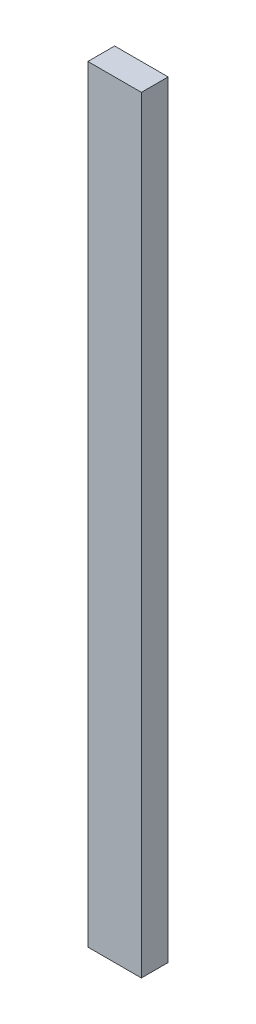
ISO-10303-21;
HEADER;
FILE_DESCRIPTION(('STEP AP214'),'2;1');
FILE_NAME('part.step','',(''),(''),'','','');
FILE_SCHEMA(('AUTOMOTIVE_DESIGN { 1 0 10303 214 1 1 1 1 }'));
ENDSEC;
DATA;
#1=APPLICATION_CONTEXT('core data for automotive mechanical design processes');
#2=APPLICATION_PROTOCOL_DEFINITION('international standard','automotive_design',2000,#1);
#3=PRODUCT_CONTEXT('',#1,'mechanical');
#4=PRODUCT('Part','Part','',(#3));
#5=PRODUCT_RELATED_PRODUCT_CATEGORY('part','',(#4));
#6=PRODUCT_DEFINITION_FORMATION('','',#4);
#7=PRODUCT_DEFINITION_CONTEXT('part definition',#1,'design');
#8=PRODUCT_DEFINITION('design','',#6,#7);
#9=PRODUCT_DEFINITION_SHAPE('','',#8);
#10=(LENGTH_UNIT() NAMED_UNIT(*) SI_UNIT(.MILLI.,.METRE.));
#11=(NAMED_UNIT(*) PLANE_ANGLE_UNIT() SI_UNIT($,.RADIAN.));
#12=(NAMED_UNIT(*) SI_UNIT($,.STERADIAN.) SOLID_ANGLE_UNIT());
#13=UNCERTAINTY_MEASURE_WITH_UNIT(LENGTH_MEASURE(1.E-05),#10,'distance_accuracy_value','');
#14=(GEOMETRIC_REPRESENTATION_CONTEXT(3) GLOBAL_UNCERTAINTY_ASSIGNED_CONTEXT((#13)) GLOBAL_UNIT_ASSIGNED_CONTEXT((#10,
#11,#12)) REPRESENTATION_CONTEXT('',''));
#15=CARTESIAN_POINT('',(0.,0.,0.));
#16=DIRECTION('',(0.,0.,1.));
#17=DIRECTION('',(1.,0.,0.));
#18=AXIS2_PLACEMENT_3D('',#15,#16,#17);
#19=CARTESIAN_POINT('',(0.,0.,6.));
#20=DIRECTION('',(0.,0.,1.));
#21=DIRECTION('',(1.,0.,0.));
#22=AXIS2_PLACEMENT_3D('',#19,#20,#21);
#23=PLANE('',#22);
#24=DIRECTION('',(-1.,0.,0.));
#25=VECTOR('',#24,1.);
#26=CARTESIAN_POINT('',(0.,-86.,6.));
#27=LINE('',#26,#25);
#28=CARTESIAN_POINT('',(6.,-86.,6.));
#29=VERTEX_POINT('',#28);
#30=CARTESIAN_POINT('',(-6.,-86.,6.));
#31=VERTEX_POINT('',#30);
#32=EDGE_CURVE('E9',#29,#31,#27,.T.);
#33=ORIENTED_EDGE('',*,*,#32,.F.);
#34=DIRECTION('',(0.,-1.,0.));
#35=VECTOR('',#34,1.);
#36=CARTESIAN_POINT('',(6.,0.,6.));
#37=LINE('',#36,#35);
#38=CARTESIAN_POINT('',(6.,86.,6.));
#39=VERTEX_POINT('',#38);
#40=EDGE_CURVE('E59',#39,#29,#37,.T.);
#41=ORIENTED_EDGE('',*,*,#40,.F.);
#42=DIRECTION('',(1.,0.,0.));
#43=VECTOR('',#42,1.);
#44=CARTESIAN_POINT('',(0.,86.,6.));
#45=LINE('',#44,#43);
#46=CARTESIAN_POINT('',(-6.,86.,6.));
#47=VERTEX_POINT('',#46);
#48=EDGE_CURVE('E85',#47,#39,#45,.T.);
#49=ORIENTED_EDGE('',*,*,#48,.F.);
#50=DIRECTION('',(0.,1.,0.));
#51=VECTOR('',#50,1.);
#52=CARTESIAN_POINT('',(-6.,0.,6.));
#53=LINE('',#52,#51);
#54=EDGE_CURVE('E22',#31,#47,#53,.T.);
#55=ORIENTED_EDGE('',*,*,#54,.F.);
#56=EDGE_LOOP('',(#33,#41,#49,#55));
#57=FACE_BOUND('',#56,.T.);
#58=ADVANCED_FACE('F15',(#57),#23,.T.);
#59=CARTESIAN_POINT('',(0.,-86.,0.));
#60=DIRECTION('',(0.,-1.,0.));
#61=DIRECTION('',(0.,0.,-1.));
#62=AXIS2_PLACEMENT_3D('',#59,#60,#61);
#63=PLANE('',#62);
#64=DIRECTION('',(0.,0.,1.));
#65=VECTOR('',#64,1.);
#66=CARTESIAN_POINT('',(6.,-86.,0.));
#67=LINE('',#66,#65);
#68=CARTESIAN_POINT('',(6.,-86.,0.));
#69=VERTEX_POINT('',#68);
#70=EDGE_CURVE('E52',#69,#29,#67,.T.);
#71=ORIENTED_EDGE('',*,*,#70,.T.);
#72=ORIENTED_EDGE('',*,*,#32,.T.);
#73=DIRECTION('',(0.,0.,1.));
#74=VECTOR('',#73,1.);
#75=CARTESIAN_POINT('',(-6.,-86.,0.));
#76=LINE('',#75,#74);
#77=CARTESIAN_POINT('',(-6.,-86.,0.));
#78=VERTEX_POINT('',#77);
#79=EDGE_CURVE('E65',#78,#31,#76,.T.);
#80=ORIENTED_EDGE('',*,*,#79,.F.);
#81=DIRECTION('',(1.,0.,0.));
#82=VECTOR('',#81,1.);
#83=CARTESIAN_POINT('',(0.,-86.,0.));
#84=LINE('',#83,#82);
#85=EDGE_CURVE('E63',#78,#69,#84,.T.);
#86=ORIENTED_EDGE('',*,*,#85,.T.);
#87=EDGE_LOOP('',(#71,#72,#80,#86));
#88=FACE_BOUND('',#87,.T.);
#89=ADVANCED_FACE('F64',(#88),#63,.T.);
#90=CARTESIAN_POINT('',(-6.,0.,0.));
#91=DIRECTION('',(-1.,0.,0.));
#92=DIRECTION('',(0.,0.,1.));
#93=AXIS2_PLACEMENT_3D('',#90,#91,#92);
#94=PLANE('',#93);
#95=ORIENTED_EDGE('',*,*,#79,.T.);
#96=ORIENTED_EDGE('',*,*,#54,.T.);
#97=DIRECTION('',(0.,0.,1.));
#98=VECTOR('',#97,1.);
#99=CARTESIAN_POINT('',(-6.,86.,0.));
#100=LINE('',#99,#98);
#101=CARTESIAN_POINT('',(-6.,86.,0.));
#102=VERTEX_POINT('',#101);
#103=EDGE_CURVE('E80',#102,#47,#100,.T.);
#104=ORIENTED_EDGE('',*,*,#103,.F.);
#105=DIRECTION('',(0.,-1.,0.));
#106=VECTOR('',#105,1.);
#107=CARTESIAN_POINT('',(-6.,0.,0.));
#108=LINE('',#107,#106);
#109=EDGE_CURVE('E69',#102,#78,#108,.T.);
#110=ORIENTED_EDGE('',*,*,#109,.T.);
#111=EDGE_LOOP('',(#95,#96,#104,#110));
#112=FACE_BOUND('',#111,.T.);
#113=ADVANCED_FACE('F89',(#112),#94,.T.);
#114=CARTESIAN_POINT('',(0.,86.,0.));
#115=DIRECTION('',(0.,1.,0.));
#116=DIRECTION('',(0.,0.,1.));
#117=AXIS2_PLACEMENT_3D('',#114,#115,#116);
#118=PLANE('',#117);
#119=ORIENTED_EDGE('',*,*,#103,.T.);
#120=ORIENTED_EDGE('',*,*,#48,.T.);
#121=DIRECTION('',(0.,0.,1.));
#122=VECTOR('',#121,1.);
#123=CARTESIAN_POINT('',(6.,86.,0.));
#124=LINE('',#123,#122);
#125=CARTESIAN_POINT('',(6.,86.,0.));
#126=VERTEX_POINT('',#125);
#127=EDGE_CURVE('E60',#126,#39,#124,.T.);
#128=ORIENTED_EDGE('',*,*,#127,.F.);
#129=DIRECTION('',(-1.,0.,0.));
#130=VECTOR('',#129,1.);
#131=CARTESIAN_POINT('',(0.,86.,0.));
#132=LINE('',#131,#130);
#133=EDGE_CURVE('E74',#126,#102,#132,.T.);
#134=ORIENTED_EDGE('',*,*,#133,.T.);
#135=EDGE_LOOP('',(#119,#120,#128,#134));
#136=FACE_BOUND('',#135,.T.);
#137=ADVANCED_FACE('F87',(#136),#118,.T.);
#138=CARTESIAN_POINT('',(0.,0.,0.));
#139=DIRECTION('',(0.,0.,-1.));
#140=DIRECTION('',(-1.,0.,0.));
#141=AXIS2_PLACEMENT_3D('',#138,#139,#140);
#142=PLANE('',#141);
#143=DIRECTION('',(0.,1.,0.));
#144=VECTOR('',#143,1.);
#145=CARTESIAN_POINT('',(6.,0.,0.));
#146=LINE('',#145,#144);
#147=EDGE_CURVE('E57',#69,#126,#146,.T.);
#148=ORIENTED_EDGE('',*,*,#147,.F.);
#149=ORIENTED_EDGE('',*,*,#85,.F.);
#150=ORIENTED_EDGE('',*,*,#109,.F.);
#151=ORIENTED_EDGE('',*,*,#133,.F.);
#152=EDGE_LOOP('',(#148,#149,#150,#151));
#153=FACE_BOUND('',#152,.T.);
#154=ADVANCED_FACE('F72',(#153),#142,.T.);
#155=CARTESIAN_POINT('',(6.,0.,0.));
#156=DIRECTION('',(1.,0.,0.));
#157=DIRECTION('',(0.,0.,-1.));
#158=AXIS2_PLACEMENT_3D('',#155,#156,#157);
#159=PLANE('',#158);
#160=ORIENTED_EDGE('',*,*,#147,.T.);
#161=ORIENTED_EDGE('',*,*,#127,.T.);
#162=ORIENTED_EDGE('',*,*,#40,.T.);
#163=ORIENTED_EDGE('',*,*,#70,.F.);
#164=EDGE_LOOP('',(#160,#161,#162,#163));
#165=FACE_BOUND('',#164,.T.);
#166=ADVANCED_FACE('F54',(#165),#159,.T.);
#167=CLOSED_SHELL('',(#58,#89,#113,#137,#154,#166));
#168=MANIFOLD_SOLID_BREP('B1',#167);
#169=ADVANCED_BREP_SHAPE_REPRESENTATION('',(#18,#168),#14);
#170=SHAPE_DEFINITION_REPRESENTATION(#9,#169);
ENDSEC;
END-ISO-10303-21;
